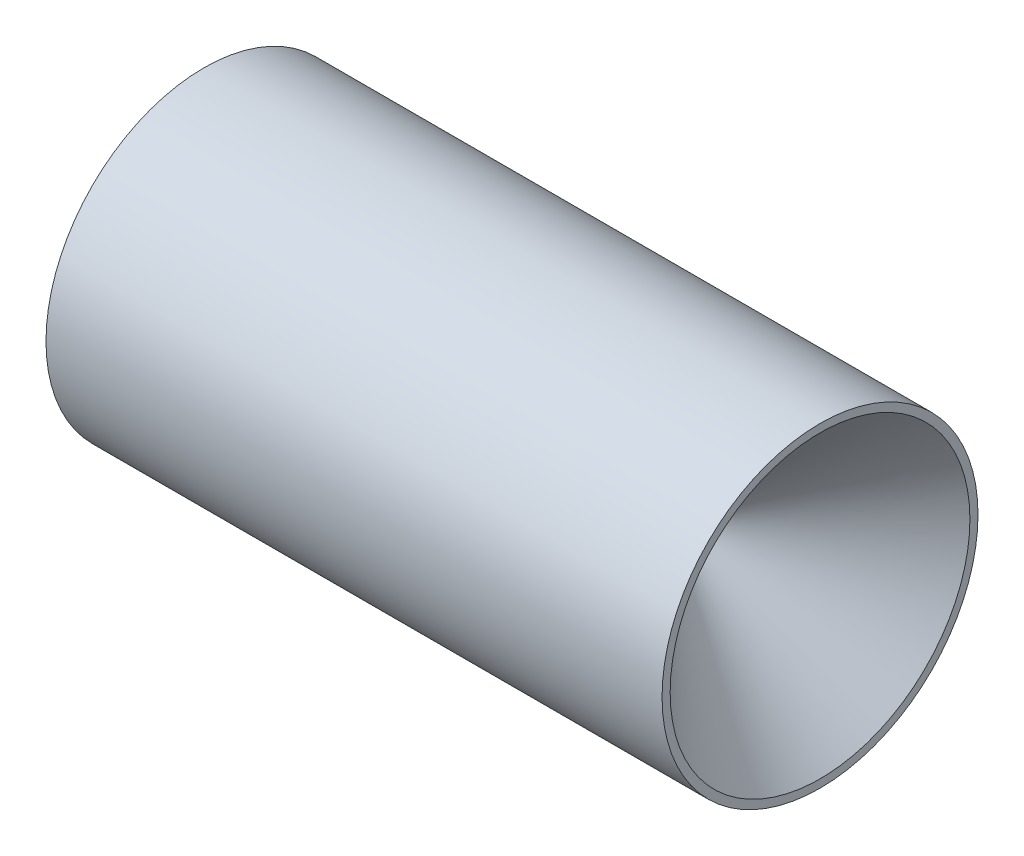
ISO-10303-21;
HEADER;
FILE_DESCRIPTION(('STEP AP214'),'2;1');
FILE_NAME('part.step','',(''),(''),'','','');
FILE_SCHEMA(('AUTOMOTIVE_DESIGN { 1 0 10303 214 1 1 1 1 }'));
ENDSEC;
DATA;
#1=APPLICATION_CONTEXT('core data for automotive mechanical design processes');
#2=APPLICATION_PROTOCOL_DEFINITION('international standard','automotive_design',2000,#1);
#3=PRODUCT_CONTEXT('',#1,'mechanical');
#4=PRODUCT('Part','Part','',(#3));
#5=PRODUCT_RELATED_PRODUCT_CATEGORY('part','',(#4));
#6=PRODUCT_DEFINITION_FORMATION('','',#4);
#7=PRODUCT_DEFINITION_CONTEXT('part definition',#1,'design');
#8=PRODUCT_DEFINITION('design','',#6,#7);
#9=PRODUCT_DEFINITION_SHAPE('','',#8);
#10=(LENGTH_UNIT() NAMED_UNIT(*) SI_UNIT(.MILLI.,.METRE.));
#11=(NAMED_UNIT(*) PLANE_ANGLE_UNIT() SI_UNIT($,.RADIAN.));
#12=(NAMED_UNIT(*) SI_UNIT($,.STERADIAN.) SOLID_ANGLE_UNIT());
#13=UNCERTAINTY_MEASURE_WITH_UNIT(LENGTH_MEASURE(1.E-05),#10,'distance_accuracy_value','');
#14=(GEOMETRIC_REPRESENTATION_CONTEXT(3) GLOBAL_UNCERTAINTY_ASSIGNED_CONTEXT((#13)) GLOBAL_UNIT_ASSIGNED_CONTEXT((#10,
#11,#12)) REPRESENTATION_CONTEXT('',''));
#15=CARTESIAN_POINT('',(0.,0.,0.));
#16=DIRECTION('',(0.,0.,1.));
#17=DIRECTION('',(1.,0.,0.));
#18=AXIS2_PLACEMENT_3D('',#15,#16,#17);
#19=CARTESIAN_POINT('',(-78.,18.3321446067541,0.));
#20=DIRECTION('',(-1.,0.,0.));
#21=DIRECTION('',(0.,0.,1.));
#22=AXIS2_PLACEMENT_3D('',#19,#20,#21);
#23=PLANE('',#22);
#24=CARTESIAN_POINT('',(-78.,0.,0.));
#25=DIRECTION('',(1.,0.,0.));
#26=DIRECTION('',(0.,0.,-1.));
#27=AXIS2_PLACEMENT_3D('',#24,#25,#26);
#28=CIRCLE('',#27,18.3321446067541);
#29=CARTESIAN_POINT('',(-78.,0.,18.3321446067541));
#30=VERTEX_POINT('',#29);
#31=EDGE_CURVE('E55',#30,#30,#28,.T.);
#32=ORIENTED_EDGE('',*,*,#31,.T.);
#33=EDGE_LOOP('',(#32));
#34=FACE_BOUND('',#33,.T.);
#35=CARTESIAN_POINT('',(-78.,0.,0.));
#36=DIRECTION('',(1.,0.,0.));
#37=DIRECTION('',(0.,0.,-1.));
#38=AXIS2_PLACEMENT_3D('',#35,#36,#37);
#39=CIRCLE('',#38,20.);
#40=CARTESIAN_POINT('',(-78.,0.,-20.));
#41=VERTEX_POINT('',#40);
#42=EDGE_CURVE('E10',#41,#41,#39,.T.);
#43=ORIENTED_EDGE('',*,*,#42,.F.);
#44=EDGE_LOOP('',(#43));
#45=FACE_BOUND('',#44,.T.);
#46=ADVANCED_FACE('F33',(#34,#45),#23,.T.);
#47=CARTESIAN_POINT('',(11.2723845428841,0.,0.));
#48=DIRECTION('',(1.,0.,0.));
#49=DIRECTION('',(0.,0.,-1.));
#50=AXIS2_PLACEMENT_3D('',#47,#48,#49);
#51=CYLINDRICAL_SURFACE('',#50,20.);
#52=ORIENTED_EDGE('',*,*,#42,.T.);
#53=EDGE_LOOP('',(#52));
#54=FACE_BOUND('',#53,.T.);
#55=CARTESIAN_POINT('',(0.,0.,0.));
#56=DIRECTION('',(1.,0.,0.));
#57=DIRECTION('',(0.,0.,-1.));
#58=AXIS2_PLACEMENT_3D('',#55,#56,#57);
#59=CIRCLE('',#58,20.);
#60=CARTESIAN_POINT('',(0.,0.,-20.));
#61=VERTEX_POINT('',#60);
#62=EDGE_CURVE('E39',#61,#61,#59,.T.);
#63=ORIENTED_EDGE('',*,*,#62,.F.);
#64=EDGE_LOOP('',(#63));
#65=FACE_BOUND('',#64,.T.);
#66=ADVANCED_FACE('F73',(#54,#65),#51,.T.);
#67=CARTESIAN_POINT('',(0.,20.,0.));
#68=DIRECTION('',(1.,0.,0.));
#69=DIRECTION('',(0.,0.,-1.));
#70=AXIS2_PLACEMENT_3D('',#67,#68,#69);
#71=PLANE('',#70);
#72=ORIENTED_EDGE('',*,*,#62,.T.);
#73=EDGE_LOOP('',(#72));
#74=FACE_BOUND('',#73,.T.);
#75=CARTESIAN_POINT('',(0.,0.,0.));
#76=DIRECTION('',(1.,0.,0.));
#77=DIRECTION('',(0.,0.,-1.));
#78=AXIS2_PLACEMENT_3D('',#75,#76,#77);
#79=CIRCLE('',#78,18.9760569613425);
#80=CARTESIAN_POINT('',(0.,0.,-18.9760569613425));
#81=VERTEX_POINT('',#80);
#82=EDGE_CURVE('E43',#81,#81,#79,.T.);
#83=ORIENTED_EDGE('',*,*,#82,.F.);
#84=EDGE_LOOP('',(#83));
#85=FACE_BOUND('',#84,.T.);
#86=ADVANCED_FACE('F77',(#74,#85),#71,.T.);
#87=CARTESIAN_POINT('',(-16.1280399240908,0.,0.));
#88=DIRECTION('',(1.,0.,0.));
#89=DIRECTION('',(0.,0.,-1.));
#90=AXIS2_PLACEMENT_3D('',#87,#88,#89);
#91=CONICAL_SURFACE('',#90,2.84801703725179,0.785398163397443);
#92=CARTESIAN_POINT('',(-16.1280399240908,0.,0.));
#93=DIRECTION('',(1.,0.,0.));
#94=DIRECTION('',(0.,0.,-1.));
#95=AXIS2_PLACEMENT_3D('',#92,#93,#94);
#96=CIRCLE('',#95,2.84801703725179);
#97=CARTESIAN_POINT('',(-16.1280399240908,0.,-2.84801703725179));
#98=VERTEX_POINT('',#97);
#99=EDGE_CURVE('E47',#98,#98,#96,.T.);
#100=CARTESIAN_POINT('',(0.,0.,-18.9760569613425));
#101=CARTESIAN_POINT('',(-0.168000415875947,0.,-18.8080565454665));
#102=CARTESIAN_POINT('',(-0.336000831751893,0.,-18.6400561295906));
#103=CARTESIAN_POINT('',(-0.672001663503785,0.,-18.3040552978387));
#104=CARTESIAN_POINT('',(-0.840002079379731,0.,-18.1360548819627));
#105=CARTESIAN_POINT('',(-1.17600291113162,0.,-17.8000540502109));
#106=CARTESIAN_POINT('',(-1.34400332700757,0.,-17.6320536343349));
#107=CARTESIAN_POINT('',(-1.68000415875946,0.,-17.296052802583));
#108=CARTESIAN_POINT('',(-1.84800457463541,0.,-17.1280523867071));
#109=CARTESIAN_POINT('',(-2.1840054063873,0.,-16.7920515549552));
#110=CARTESIAN_POINT('',(-2.35200582226325,0.,-16.6240511390792));
#111=CARTESIAN_POINT('',(-2.68800665401514,0.,-16.2880503073274));
#112=CARTESIAN_POINT('',(-2.85600706989109,0.,-16.1200498914514));
#113=CARTESIAN_POINT('',(-3.19200790164298,0.,-15.7840490596995));
#114=CARTESIAN_POINT('',(-3.36000831751893,0.,-15.6160486438236));
#115=CARTESIAN_POINT('',(-3.69600914927082,0.,-15.2800478120717));
#116=CARTESIAN_POINT('',(-3.86400956514676,0.,-15.1120473961957));
#117=CARTESIAN_POINT('',(-4.20001039689866,0.,-14.7760465644439));
#118=CARTESIAN_POINT('',(-4.3680108127746,0.,-14.6080461485679));
#119=CARTESIAN_POINT('',(-4.7040116445265,0.,-14.272045316816));
#120=CARTESIAN_POINT('',(-4.87201206040244,0.,-14.1040449009401));
#121=CARTESIAN_POINT('',(-5.20801289215433,0.,-13.7680440691882));
#122=CARTESIAN_POINT('',(-5.37601330803028,0.,-13.6000436533122));
#123=CARTESIAN_POINT('',(-5.71201413978217,0.,-13.2640428215604));
#124=CARTESIAN_POINT('',(-5.88001455565812,0.,-13.0960424056844));
#125=CARTESIAN_POINT('',(-6.21601538741001,0.,-12.7600415739325));
#126=CARTESIAN_POINT('',(-6.38401580328596,0.,-12.5920411580566));
#127=CARTESIAN_POINT('',(-6.72001663503785,0.,-12.2560403263047));
#128=CARTESIAN_POINT('',(-6.8880170509138,0.,-12.0880399104287));
#129=CARTESIAN_POINT('',(-7.22401788266569,0.,-11.7520390786769));
#130=CARTESIAN_POINT('',(-7.39201829854164,0.,-11.5840386628009));
#131=CARTESIAN_POINT('',(-7.72801913029353,0.,-11.248037831049));
#132=CARTESIAN_POINT('',(-7.89601954616948,0.,-11.0800374151731));
#133=CARTESIAN_POINT('',(-8.23202037792137,0.,-10.7440365834212));
#134=CARTESIAN_POINT('',(-8.40002079379732,0.,-10.5760361675452));
#135=CARTESIAN_POINT('',(-8.73602162554921,0.,-10.2400353357934));
#136=CARTESIAN_POINT('',(-8.90402204142515,0.,-10.0720349199174));
#137=CARTESIAN_POINT('',(-9.24002287317705,0.,-9.73603408816552));
#138=CARTESIAN_POINT('',(-9.40802328905299,0.,-9.56803367228957));
#139=CARTESIAN_POINT('',(-9.74402412080489,0.,-9.23203284053768));
#140=CARTESIAN_POINT('',(-9.91202453668083,0.,-9.06403242466174));
#141=CARTESIAN_POINT('',(-10.2480253684327,0.,-8.72803159290985));
#142=CARTESIAN_POINT('',(-10.4160257843087,0.,-8.56003117703391));
#143=CARTESIAN_POINT('',(-10.7520266160606,0.,-8.22403034528202));
#144=CARTESIAN_POINT('',(-10.9200270319365,0.,-8.05602992940607));
#145=CARTESIAN_POINT('',(-11.2560278636884,0.,-7.72002909765418));
#146=CARTESIAN_POINT('',(-11.4240282795643,0.,-7.55202868177824));
#147=CARTESIAN_POINT('',(-11.7600291113162,0.,-7.21602785002635));
#148=CARTESIAN_POINT('',(-11.9280295271922,0.,-7.0480274341504));
#149=CARTESIAN_POINT('',(-12.2640303589441,0.,-6.71202660239851));
#150=CARTESIAN_POINT('',(-12.43203077482,0.,-6.54402618652257));
#151=CARTESIAN_POINT('',(-12.7680316065719,0.,-6.20802535477068));
#152=CARTESIAN_POINT('',(-12.9360320224479,0.,-6.04002493889474));
#153=CARTESIAN_POINT('',(-13.2720328541998,0.,-5.70402410714285));
#154=CARTESIAN_POINT('',(-13.4400332700757,0.,-5.5360236912669));
#155=CARTESIAN_POINT('',(-13.7760341018276,0.,-5.20002285951501));
#156=CARTESIAN_POINT('',(-13.9440345177035,0.,-5.03202244363907));
#157=CARTESIAN_POINT('',(-14.2800353494554,0.,-4.69602161188718));
#158=CARTESIAN_POINT('',(-14.4480357653314,0.,-4.52802119601123));
#159=CARTESIAN_POINT('',(-14.7840365970833,0.,-4.19202036425934));
#160=CARTESIAN_POINT('',(-14.9520370129592,0.,-4.0240199483834));
#161=CARTESIAN_POINT('',(-15.2880378447111,0.,-3.68801911663151));
#162=CARTESIAN_POINT('',(-15.4560382605871,0.,-3.52001870075557));
#163=CARTESIAN_POINT('',(-15.792039092339,0.,-3.18401786900368));
#164=CARTESIAN_POINT('',(-15.9600395082149,0.,-3.01601745312773));
#165=CARTESIAN_POINT('',(-16.1280399240908,0.,-2.84801703725179));
#166=B_SPLINE_CURVE_WITH_KNOTS('',3,(#100,#101,#102,#103,#104,#105,#106,#107,#108,#109,#110,
#111,#112,#113,#114,#115,#116,#117,#118,#119,#120,#121,#122,#123,#124,#125,#126,#127,#128,#129,
#130,#131,#132,#133,#134,#135,#136,#137,#138,#139,#140,#141,#142,#143,#144,#145,#146,#147,#148,
#149,#150,#151,#152,#153,#154,#155,#156,#157,#158,#159,#160,#161,#162,#163,#164,#165),
.UNSPECIFIED.,.F.,.F.,(4,2,2,2,2,2,2,2,2,2,2,2,2,2,2,2,2,2,2,2,2,2,2,2,2,2,2,2,2,2,2,2,4),(0.,
0.712765399848248,1.4255307996965,2.13829619954474,2.85106159939299,3.56382699924123,
4.27659239908948,4.98935779893773,5.70212319878598,6.41488859863422,7.12765399848247,
7.84041939833071,8.55318479817896,9.26595019802721,9.97871559787546,10.6914809977237,
11.4042463975719,12.1170117974202,12.8297771972684,13.5425425971167,14.2553079969649,
14.9680733968132,15.6808387966614,16.3936041965097,17.1063695963579,17.8191349962062,
18.5319003960544,19.2446657959027,19.9574311957509,20.6701965955992,21.3829619954474,
22.0957273952956,22.8084927951439),.UNSPECIFIED.);
#167=EDGE_CURVE('BSEAM69',#81,#98,#166,.T.);
#168=ORIENTED_EDGE('',*,*,#82,.T.);
#169=ORIENTED_EDGE('',*,*,#99,.F.);
#170=ORIENTED_EDGE('',*,*,#167,.T.);
#171=ORIENTED_EDGE('',*,*,#167,.F.);
#172=EDGE_LOOP('',(#168,#170,#169,#171));
#173=FACE_BOUND('',#172,.T.);
#174=ADVANCED_FACE('F69',(#173),#91,.F.);
#175=CARTESIAN_POINT('',(11.2723845428841,0.,0.));
#176=DIRECTION('',(1.,0.,0.));
#177=DIRECTION('',(0.,0.,-1.));
#178=AXIS2_PLACEMENT_3D('',#175,#176,#177);
#179=CYLINDRICAL_SURFACE('',#178,2.84801703725179);
#180=ORIENTED_EDGE('',*,*,#99,.T.);
#181=EDGE_LOOP('',(#180));
#182=FACE_BOUND('',#181,.T.);
#183=CARTESIAN_POINT('',(-20.2124491997397,0.,0.));
#184=DIRECTION('',(1.,0.,0.));
#185=DIRECTION('',(0.,0.,-1.));
#186=AXIS2_PLACEMENT_3D('',#183,#184,#185);
#187=CIRCLE('',#186,2.84801703725179);
#188=CARTESIAN_POINT('',(-20.2124491997397,0.,2.84801703725179));
#189=VERTEX_POINT('',#188);
#190=EDGE_CURVE('E52',#189,#189,#187,.T.);
#191=ORIENTED_EDGE('',*,*,#190,.F.);
#192=EDGE_LOOP('',(#191));
#193=FACE_BOUND('',#192,.T.);
#194=ADVANCED_FACE('F63',(#182,#193),#179,.F.);
#195=CARTESIAN_POINT('',(-78.,0.,0.));
#196=DIRECTION('',(-1.,0.,0.));
#197=DIRECTION('',(0.,0.,1.));
#198=AXIS2_PLACEMENT_3D('',#195,#196,#197);
#199=CONICAL_SURFACE('',#198,18.3321446067541,0.26179938779915);
#200=CARTESIAN_POINT('',(-20.2124491997397,0.,2.84801703725179));
#201=CARTESIAN_POINT('',(-20.8144028539091,0.,3.00931003276744));
#202=CARTESIAN_POINT('',(-21.4163565080784,0.,3.17060302828309));
#203=CARTESIAN_POINT('',(-22.6202638164172,0.,3.49318901931439));
#204=CARTESIAN_POINT('',(-23.2222174705866,0.,3.65448201483003));
#205=CARTESIAN_POINT('',(-24.4261247789253,0.,3.97706800586133));
#206=CARTESIAN_POINT('',(-25.0280784330947,0.,4.13836100137698));
#207=CARTESIAN_POINT('',(-26.2319857414335,0.,4.46094699240828));
#208=CARTESIAN_POINT('',(-26.8339393956029,0.,4.62223998792393));
#209=CARTESIAN_POINT('',(-28.0378467039416,0.,4.94482597895523));
#210=CARTESIAN_POINT('',(-28.639800358111,0.,5.10611897447087));
#211=CARTESIAN_POINT('',(-29.8437076664497,0.,5.42870496550217));
#212=CARTESIAN_POINT('',(-30.4456613206191,0.,5.58999796101782));
#213=CARTESIAN_POINT('',(-31.6495686289579,0.,5.91258395204912));
#214=CARTESIAN_POINT('',(-32.2515222831273,0.,6.07387694756476));
#215=CARTESIAN_POINT('',(-33.455429591466,0.,6.39646293859606));
#216=CARTESIAN_POINT('',(-34.0573832456354,0.,6.55775593411171));
#217=CARTESIAN_POINT('',(-35.2612905539741,0.,6.88034192514301));
#218=CARTESIAN_POINT('',(-35.8632442081435,0.,7.04163492065866));
#219=CARTESIAN_POINT('',(-37.0671515164823,0.,7.36422091168996));
#220=CARTESIAN_POINT('',(-37.6691051706517,0.,7.5255139072056));
#221=CARTESIAN_POINT('',(-38.8730124789904,0.,7.8480998982369));
#222=CARTESIAN_POINT('',(-39.4749661331598,0.,8.00939289375255));
#223=CARTESIAN_POINT('',(-40.6788734414986,0.,8.33197888478385));
#224=CARTESIAN_POINT('',(-41.2808270956679,0.,8.4932718802995));
#225=CARTESIAN_POINT('',(-42.4847344040067,0.,8.81585787133079));
#226=CARTESIAN_POINT('',(-43.0866880581761,0.,8.97715086684644));
#227=CARTESIAN_POINT('',(-44.2905953665148,0.,9.29973685787774));
#228=CARTESIAN_POINT('',(-44.8925490206842,0.,9.46102985339339));
#229=CARTESIAN_POINT('',(-46.096456329023,0.,9.78361584442468));
#230=CARTESIAN_POINT('',(-46.6984099831923,0.,9.94490883994033));
#231=CARTESIAN_POINT('',(-47.9023172915311,0.,10.2674948309716));
#232=CARTESIAN_POINT('',(-48.5042709457005,0.,10.4287878264873));
#233=CARTESIAN_POINT('',(-49.7081782540392,0.,10.7513738175186));
#234=CARTESIAN_POINT('',(-50.3101319082086,0.,10.9126668130342));
#235=CARTESIAN_POINT('',(-51.5140392165474,0.,11.2352528040655));
#236=CARTESIAN_POINT('',(-52.1159928707167,0.,11.3965457995812));
#237=CARTESIAN_POINT('',(-53.3199001790555,0.,11.7191317906125));
#238=CARTESIAN_POINT('',(-53.9218538332249,0.,11.8804247861281));
#239=CARTESIAN_POINT('',(-55.1257611415636,0.,12.2030107771594));
#240=CARTESIAN_POINT('',(-55.727714795733,0.,12.3643037726751));
#241=CARTESIAN_POINT('',(-56.9316221040718,0.,12.6868897637064));
#242=CARTESIAN_POINT('',(-57.5335757582411,0.,12.848182759222));
#243=CARTESIAN_POINT('',(-58.7374830665799,0.,13.1707687502533));
#244=CARTESIAN_POINT('',(-59.3394367207493,0.,13.332061745769));
#245=CARTESIAN_POINT('',(-60.543344029088,0.,13.6546477368002));
#246=CARTESIAN_POINT('',(-61.1452976832574,0.,13.8159407323159));
#247=CARTESIAN_POINT('',(-62.3492049915962,0.,14.1385267233472));
#248=CARTESIAN_POINT('',(-62.9511586457656,0.,14.2998197188628));
#249=CARTESIAN_POINT('',(-64.1550659541043,0.,14.6224057098941));
#250=CARTESIAN_POINT('',(-64.7570196082737,0.,14.7836987054098));
#251=CARTESIAN_POINT('',(-65.9609269166124,0.,15.1062846964411));
#252=CARTESIAN_POINT('',(-66.5628805707818,0.,15.2675776919567));
#253=CARTESIAN_POINT('',(-67.7667878791206,0.,15.590163682988));
#254=CARTESIAN_POINT('',(-68.3687415332899,0.,15.7514566785037));
#255=CARTESIAN_POINT('',(-69.5726488416287,0.,16.074042669535));
#256=CARTESIAN_POINT('',(-70.1746024957981,0.,16.2353356650506));
#257=CARTESIAN_POINT('',(-71.3785098041369,0.,16.5579216560819));
#258=CARTESIAN_POINT('',(-71.9804634583062,0.,16.7192146515976));
#259=CARTESIAN_POINT('',(-73.184370766645,0.,17.0418006426289));
#260=CARTESIAN_POINT('',(-73.7863244208144,0.,17.2030936381445));
#261=CARTESIAN_POINT('',(-74.9902317291531,0.,17.5256796291758));
#262=CARTESIAN_POINT('',(-75.5921853833225,0.,17.6869726246915));
#263=CARTESIAN_POINT('',(-76.7960926916613,0.,18.0095586157228));
#264=CARTESIAN_POINT('',(-77.3980463458306,0.,18.1708516112384));
#265=CARTESIAN_POINT('',(-78.,0.,18.3321446067541));
#266=B_SPLINE_CURVE_WITH_KNOTS('',3,(#200,#201,#202,#203,#204,#205,#206,#207,#208,#209,#210,
#211,#212,#213,#214,#215,#216,#217,#218,#219,#220,#221,#222,#223,#224,#225,#226,#227,#228,#229,
#230,#231,#232,#233,#234,#235,#236,#237,#238,#239,#240,#241,#242,#243,#244,#245,#246,#247,#248,
#249,#250,#251,#252,#253,#254,#255,#256,#257,#258,#259,#260,#261,#262,#263,#264,#265),
.UNSPECIFIED.,.F.,.F.,(4,2,2,2,2,2,2,2,2,2,2,2,2,2,2,2,2,2,2,2,2,2,2,2,2,2,2,2,2,2,2,2,4),(0.,
1.8695648396171,3.7391296792342,5.6086945188513,7.47825935846839,9.34782419808549,
11.2173890377026,13.0869538773197,14.9565187169368,16.8260835565539,18.695648396171,
20.5652132357881,22.4347780754052,24.3043429150223,26.1739077546394,28.0434725942565,
29.9130374338736,31.7826022734907,33.6521671131078,35.5217319527249,37.391296792342,
39.2608616319591,41.1304264715762,42.9999913111933,44.8695561508104,46.7391209904275,
48.6086858300446,50.4782506696616,52.3478155092788,54.2173803488958,56.086945188513,
57.95651002813,59.8260748677472),.UNSPECIFIED.);
#267=EDGE_CURVE('BSEAM61',#189,#30,#266,.T.);
#268=ORIENTED_EDGE('',*,*,#190,.T.);
#269=ORIENTED_EDGE('',*,*,#31,.F.);
#270=ORIENTED_EDGE('',*,*,#267,.T.);
#271=ORIENTED_EDGE('',*,*,#267,.F.);
#272=EDGE_LOOP('',(#268,#270,#269,#271));
#273=FACE_BOUND('',#272,.T.);
#274=ADVANCED_FACE('F61',(#273),#199,.F.);
#275=CLOSED_SHELL('',(#46,#66,#86,#174,#194,#274));
#276=MANIFOLD_SOLID_BREP('B2',#275);
#277=ADVANCED_BREP_SHAPE_REPRESENTATION('',(#18,#276),#14);
#278=SHAPE_DEFINITION_REPRESENTATION(#9,#277);
ENDSEC;
END-ISO-10303-21;
